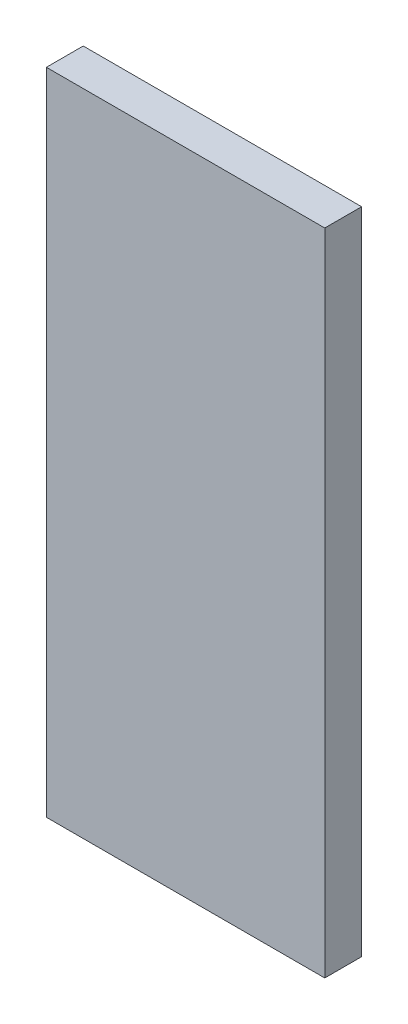
ISO-10303-21;
HEADER;
FILE_DESCRIPTION(('STEP AP214'),'2;1');
FILE_NAME('part.step','',(''),(''),'','','');
FILE_SCHEMA(('AUTOMOTIVE_DESIGN { 1 0 10303 214 1 1 1 1 }'));
ENDSEC;
DATA;
#1=APPLICATION_CONTEXT('core data for automotive mechanical design processes');
#2=APPLICATION_PROTOCOL_DEFINITION('international standard','automotive_design',2000,#1);
#3=PRODUCT_CONTEXT('',#1,'mechanical');
#4=PRODUCT('Part','Part','',(#3));
#5=PRODUCT_RELATED_PRODUCT_CATEGORY('part','',(#4));
#6=PRODUCT_DEFINITION_FORMATION('','',#4);
#7=PRODUCT_DEFINITION_CONTEXT('part definition',#1,'design');
#8=PRODUCT_DEFINITION('design','',#6,#7);
#9=PRODUCT_DEFINITION_SHAPE('','',#8);
#10=(LENGTH_UNIT() NAMED_UNIT(*) SI_UNIT(.MILLI.,.METRE.));
#11=(NAMED_UNIT(*) PLANE_ANGLE_UNIT() SI_UNIT($,.RADIAN.));
#12=(NAMED_UNIT(*) SI_UNIT($,.STERADIAN.) SOLID_ANGLE_UNIT());
#13=UNCERTAINTY_MEASURE_WITH_UNIT(LENGTH_MEASURE(1.E-05),#10,'distance_accuracy_value','');
#14=(GEOMETRIC_REPRESENTATION_CONTEXT(3) GLOBAL_UNCERTAINTY_ASSIGNED_CONTEXT((#13)) GLOBAL_UNIT_ASSIGNED_CONTEXT((#10,
#11,#12)) REPRESENTATION_CONTEXT('',''));
#15=CARTESIAN_POINT('',(0.,0.,0.));
#16=DIRECTION('',(0.,0.,1.));
#17=DIRECTION('',(1.,0.,0.));
#18=AXIS2_PLACEMENT_3D('',#15,#16,#17);
#19=CARTESIAN_POINT('',(7.55339205056771,-17.6248732918793,2.));
#20=DIRECTION('',(-1.,0.,0.));
#21=DIRECTION('',(0.,0.,1.));
#22=AXIS2_PLACEMENT_3D('',#19,#20,#21);
#23=PLANE('',#22);
#24=DIRECTION('',(0.,1.,0.));
#25=VECTOR('',#24,1.);
#26=CARTESIAN_POINT('',(7.55339205056771,-17.6248732918793,0.));
#27=LINE('',#26,#25);
#28=CARTESIAN_POINT('',(7.55339205056771,-17.6248732918793,0.));
#29=VERTEX_POINT('',#28);
#30=CARTESIAN_POINT('',(7.55339205056771,17.6248732918793,0.));
#31=VERTEX_POINT('',#30);
#32=EDGE_CURVE('E100',#29,#31,#27,.T.);
#33=ORIENTED_EDGE('',*,*,#32,.T.);
#34=DIRECTION('',(0.,0.,-1.));
#35=VECTOR('',#34,1.);
#36=CARTESIAN_POINT('',(7.55339205056771,17.6248732918793,2.));
#37=LINE('',#36,#35);
#38=CARTESIAN_POINT('',(7.55339205056771,17.6248732918793,2.));
#39=VERTEX_POINT('',#38);
#40=EDGE_CURVE('E91',#39,#31,#37,.T.);
#41=ORIENTED_EDGE('',*,*,#40,.F.);
#42=DIRECTION('',(0.,1.,0.));
#43=VECTOR('',#42,1.);
#44=CARTESIAN_POINT('',(7.55339205056771,-17.6248732918793,2.));
#45=LINE('',#44,#43);
#46=CARTESIAN_POINT('',(7.55339205056771,-17.6248732918793,2.));
#47=VERTEX_POINT('',#46);
#48=EDGE_CURVE('E85',#47,#39,#45,.T.);
#49=ORIENTED_EDGE('',*,*,#48,.F.);
#50=DIRECTION('',(0.,0.,-1.));
#51=VECTOR('',#50,1.);
#52=CARTESIAN_POINT('',(7.55339205056771,-17.6248732918793,2.));
#53=LINE('',#52,#51);
#54=EDGE_CURVE('E96',#47,#29,#53,.T.);
#55=ORIENTED_EDGE('',*,*,#54,.T.);
#56=EDGE_LOOP('',(#33,#41,#49,#55));
#57=FACE_BOUND('',#56,.T.);
#58=ADVANCED_FACE('F32',(#57),#23,.F.);
#59=CARTESIAN_POINT('',(-7.55339205056771,17.6248732918793,2.));
#60=DIRECTION('',(0.,-1.,0.));
#61=DIRECTION('',(0.,0.,-1.));
#62=AXIS2_PLACEMENT_3D('',#59,#60,#61);
#63=PLANE('',#62);
#64=DIRECTION('',(-1.,0.,0.));
#65=VECTOR('',#64,1.);
#66=CARTESIAN_POINT('',(-7.55339205056771,17.6248732918793,0.));
#67=LINE('',#66,#65);
#68=CARTESIAN_POINT('',(-7.55339205056771,17.6248732918793,0.));
#69=VERTEX_POINT('',#68);
#70=EDGE_CURVE('E90',#31,#69,#67,.T.);
#71=ORIENTED_EDGE('',*,*,#70,.T.);
#72=DIRECTION('',(0.,0.,-1.));
#73=VECTOR('',#72,1.);
#74=CARTESIAN_POINT('',(-7.55339205056771,17.6248732918793,2.));
#75=LINE('',#74,#73);
#76=CARTESIAN_POINT('',(-7.55339205056771,17.6248732918793,2.));
#77=VERTEX_POINT('',#76);
#78=EDGE_CURVE('E88',#77,#69,#75,.T.);
#79=ORIENTED_EDGE('',*,*,#78,.F.);
#80=DIRECTION('',(-1.,0.,0.));
#81=VECTOR('',#80,1.);
#82=CARTESIAN_POINT('',(-7.55339205056771,17.6248732918793,2.));
#83=LINE('',#82,#81);
#84=EDGE_CURVE('E80',#39,#77,#83,.T.);
#85=ORIENTED_EDGE('',*,*,#84,.F.);
#86=ORIENTED_EDGE('',*,*,#40,.T.);
#87=EDGE_LOOP('',(#71,#79,#85,#86));
#88=FACE_BOUND('',#87,.T.);
#89=ADVANCED_FACE('F89',(#88),#63,.F.);
#90=CARTESIAN_POINT('',(-7.55339205056771,-17.6248732918793,2.));
#91=DIRECTION('',(1.,0.,0.));
#92=DIRECTION('',(0.,0.,-1.));
#93=AXIS2_PLACEMENT_3D('',#90,#91,#92);
#94=PLANE('',#93);
#95=DIRECTION('',(0.,-1.,0.));
#96=VECTOR('',#95,1.);
#97=CARTESIAN_POINT('',(-7.55339205056771,-17.6248732918793,0.));
#98=LINE('',#97,#96);
#99=CARTESIAN_POINT('',(-7.55339205056771,-17.6248732918793,0.));
#100=VERTEX_POINT('',#99);
#101=EDGE_CURVE('E66',#69,#100,#98,.T.);
#102=ORIENTED_EDGE('',*,*,#101,.T.);
#103=DIRECTION('',(0.,0.,-1.));
#104=VECTOR('',#103,1.);
#105=CARTESIAN_POINT('',(-7.55339205056771,-17.6248732918793,2.));
#106=LINE('',#105,#104);
#107=CARTESIAN_POINT('',(-7.55339205056771,-17.6248732918793,2.));
#108=VERTEX_POINT('',#107);
#109=EDGE_CURVE('E92',#108,#100,#106,.T.);
#110=ORIENTED_EDGE('',*,*,#109,.F.);
#111=DIRECTION('',(0.,-1.,0.));
#112=VECTOR('',#111,1.);
#113=CARTESIAN_POINT('',(-7.55339205056771,-17.6248732918793,2.));
#114=LINE('',#113,#112);
#115=EDGE_CURVE('E83',#77,#108,#114,.T.);
#116=ORIENTED_EDGE('',*,*,#115,.F.);
#117=ORIENTED_EDGE('',*,*,#78,.T.);
#118=EDGE_LOOP('',(#102,#110,#116,#117));
#119=FACE_BOUND('',#118,.T.);
#120=ADVANCED_FACE('F94',(#119),#94,.F.);
#121=CARTESIAN_POINT('',(-7.55339205056771,-17.6248732918793,2.));
#122=DIRECTION('',(0.,1.,0.));
#123=DIRECTION('',(0.,0.,1.));
#124=AXIS2_PLACEMENT_3D('',#121,#122,#123);
#125=PLANE('',#124);
#126=DIRECTION('',(1.,0.,0.));
#127=VECTOR('',#126,1.);
#128=CARTESIAN_POINT('',(-7.55339205056771,-17.6248732918793,0.));
#129=LINE('',#128,#127);
#130=EDGE_CURVE('E72',#100,#29,#129,.T.);
#131=ORIENTED_EDGE('',*,*,#130,.T.);
#132=ORIENTED_EDGE('',*,*,#54,.F.);
#133=DIRECTION('',(1.,0.,0.));
#134=VECTOR('',#133,1.);
#135=CARTESIAN_POINT('',(-7.55339205056771,-17.6248732918793,2.));
#136=LINE('',#135,#134);
#137=EDGE_CURVE('E49',#108,#47,#136,.T.);
#138=ORIENTED_EDGE('',*,*,#137,.F.);
#139=ORIENTED_EDGE('',*,*,#109,.T.);
#140=EDGE_LOOP('',(#131,#132,#138,#139));
#141=FACE_BOUND('',#140,.T.);
#142=ADVANCED_FACE('F139',(#141),#125,.F.);
#143=CARTESIAN_POINT('',(0.,0.,2.));
#144=DIRECTION('',(0.,0.,-1.));
#145=DIRECTION('',(-1.,0.,0.));
#146=AXIS2_PLACEMENT_3D('',#143,#144,#145);
#147=PLANE('',#146);
#148=ORIENTED_EDGE('',*,*,#48,.T.);
#149=ORIENTED_EDGE('',*,*,#84,.T.);
#150=ORIENTED_EDGE('',*,*,#115,.T.);
#151=ORIENTED_EDGE('',*,*,#137,.T.);
#152=EDGE_LOOP('',(#148,#149,#150,#151));
#153=FACE_BOUND('',#152,.T.);
#154=ADVANCED_FACE('F81',(#153),#147,.F.);
#155=CARTESIAN_POINT('',(0.,0.,0.));
#156=DIRECTION('',(0.,0.,-1.));
#157=DIRECTION('',(-1.,0.,0.));
#158=AXIS2_PLACEMENT_3D('',#155,#156,#157);
#159=PLANE('',#158);
#160=CARTESIAN_POINT('',(0.,0.,0.));
#161=DIRECTION('',(0.,0.,-1.));
#162=DIRECTION('',(-1.,0.,0.));
#163=AXIS2_PLACEMENT_3D('',#160,#161,#162);
#164=CIRCLE('',#163,2.13517825626752);
#165=CARTESIAN_POINT('',(-2.13517825626752,0.,0.));
#166=VERTEX_POINT('',#165);
#167=EDGE_CURVE('E234',#166,#166,#164,.T.);
#168=ORIENTED_EDGE('',*,*,#167,.F.);
#169=EDGE_LOOP('',(#168));
#170=FACE_BOUND('',#169,.T.);
#171=CARTESIAN_POINT('',(0.,10.5415906277031,0.));
#172=DIRECTION('',(0.,0.,-1.));
#173=DIRECTION('',(-1.,0.,0.));
#174=AXIS2_PLACEMENT_3D('',#171,#172,#173);
#175=CIRCLE('',#174,1.88008087449413);
#176=CARTESIAN_POINT('',(-1.88008087449413,10.5415906277031,0.));
#177=VERTEX_POINT('',#176);
#178=EDGE_CURVE('E103',#177,#177,#175,.T.);
#179=ORIENTED_EDGE('',*,*,#178,.F.);
#180=EDGE_LOOP('',(#179));
#181=FACE_BOUND('',#180,.T.);
#182=ORIENTED_EDGE('',*,*,#32,.F.);
#183=ORIENTED_EDGE('',*,*,#130,.F.);
#184=ORIENTED_EDGE('',*,*,#101,.F.);
#185=ORIENTED_EDGE('',*,*,#70,.F.);
#186=EDGE_LOOP('',(#182,#183,#184,#185));
#187=FACE_BOUND('',#186,.T.);
#188=ADVANCED_FACE('F142',(#170,#181,#187),#159,.T.);
#189=CARTESIAN_POINT('',(0.,10.5415906277031,-3.));
#190=DIRECTION('',(0.,0.,1.));
#191=DIRECTION('',(1.,0.,0.));
#192=AXIS2_PLACEMENT_3D('',#189,#190,#191);
#193=CYLINDRICAL_SURFACE('',#192,1.88008087449413);
#194=CARTESIAN_POINT('',(0.,10.5415906277031,-1.5));
#195=DIRECTION('',(0.,0.,-1.));
#196=DIRECTION('',(-1.,0.,0.));
#197=AXIS2_PLACEMENT_3D('',#194,#195,#196);
#198=CIRCLE('',#197,1.88008087449413);
#199=CARTESIAN_POINT('',(-1.88008087449413,10.5415906277031,-1.5));
#200=VERTEX_POINT('',#199);
#201=EDGE_CURVE('E11',#200,#200,#198,.F.);
#202=ORIENTED_EDGE('',*,*,#201,.T.);
#203=EDGE_LOOP('',(#202));
#204=FACE_BOUND('',#203,.T.);
#205=ORIENTED_EDGE('',*,*,#178,.T.);
#206=EDGE_LOOP('',(#205));
#207=FACE_BOUND('',#206,.T.);
#208=ADVANCED_FACE('F145',(#204,#207),#193,.T.);
#209=CARTESIAN_POINT('',(0.,10.5415906277031,-3.));
#210=DIRECTION('',(0.,0.,-1.));
#211=DIRECTION('',(-1.,0.,0.));
#212=AXIS2_PLACEMENT_3D('',#209,#210,#211);
#213=PLANE('',#212);
#214=CARTESIAN_POINT('',(0.,10.5415906277031,-3.));
#215=DIRECTION('',(0.,0.,-1.));
#216=DIRECTION('',(-1.,0.,0.));
#217=AXIS2_PLACEMENT_3D('',#214,#215,#216);
#218=CIRCLE('',#217,0.380080874494128);
#219=CARTESIAN_POINT('',(-0.380080874494128,10.5415906277031,-3.));
#220=VERTEX_POINT('',#219);
#221=EDGE_CURVE('E41',#220,#220,#218,.T.);
#222=ORIENTED_EDGE('',*,*,#221,.T.);
#223=EDGE_LOOP('',(#222));
#224=FACE_BOUND('',#223,.T.);
#225=ADVANCED_FACE('F118',(#224),#213,.T.);
#226=CARTESIAN_POINT('',(0.,0.,-3.));
#227=DIRECTION('',(0.,0.,1.));
#228=DIRECTION('',(1.,0.,0.));
#229=AXIS2_PLACEMENT_3D('',#226,#227,#228);
#230=CYLINDRICAL_SURFACE('',#229,2.13517825626752);
#231=CARTESIAN_POINT('',(0.,0.,-1.5));
#232=DIRECTION('',(0.,0.,-1.));
#233=DIRECTION('',(-1.,0.,0.));
#234=AXIS2_PLACEMENT_3D('',#231,#232,#233);
#235=CIRCLE('',#234,2.13517825626752);
#236=CARTESIAN_POINT('',(-2.13517825626752,0.,-1.5));
#237=VERTEX_POINT('',#236);
#238=EDGE_CURVE('E113',#237,#237,#235,.F.);
#239=ORIENTED_EDGE('',*,*,#238,.T.);
#240=EDGE_LOOP('',(#239));
#241=FACE_BOUND('',#240,.T.);
#242=ORIENTED_EDGE('',*,*,#167,.T.);
#243=EDGE_LOOP('',(#242));
#244=FACE_BOUND('',#243,.T.);
#245=ADVANCED_FACE('F154',(#241,#244),#230,.T.);
#246=CARTESIAN_POINT('',(0.,0.,-3.));
#247=DIRECTION('',(0.,0.,-1.));
#248=DIRECTION('',(-1.,0.,0.));
#249=AXIS2_PLACEMENT_3D('',#246,#247,#248);
#250=PLANE('',#249);
#251=CARTESIAN_POINT('',(0.,0.,-3.));
#252=DIRECTION('',(0.,0.,-1.));
#253=DIRECTION('',(-1.,0.,0.));
#254=AXIS2_PLACEMENT_3D('',#251,#252,#253);
#255=CIRCLE('',#254,0.635178256267523);
#256=CARTESIAN_POINT('',(-0.635178256267523,0.,-3.));
#257=VERTEX_POINT('',#256);
#258=EDGE_CURVE('E110',#257,#257,#255,.T.);
#259=ORIENTED_EDGE('',*,*,#258,.T.);
#260=EDGE_LOOP('',(#259));
#261=FACE_BOUND('',#260,.T.);
#262=ADVANCED_FACE('F126',(#261),#250,.T.);
#263=CARTESIAN_POINT('',(0.,0.,-1.5));
#264=DIRECTION('',(0.,0.,-1.));
#265=DIRECTION('',(-1.,0.,0.));
#266=AXIS2_PLACEMENT_3D('',#263,#264,#265);
#267=DEGENERATE_TOROIDAL_SURFACE('',#266,0.635178256267523,1.5,.T.);
#268=ORIENTED_EDGE('',*,*,#238,.F.);
#269=EDGE_LOOP('',(#268));
#270=FACE_BOUND('',#269,.T.);
#271=ORIENTED_EDGE('',*,*,#258,.F.);
#272=EDGE_LOOP('',(#271));
#273=FACE_BOUND('',#272,.T.);
#274=ADVANCED_FACE('F121',(#270,#273),#267,.T.);
#275=CARTESIAN_POINT('',(0.,10.5415906277031,-1.5));
#276=DIRECTION('',(0.,0.,-1.));
#277=DIRECTION('',(-1.,0.,0.));
#278=AXIS2_PLACEMENT_3D('',#275,#276,#277);
#279=DEGENERATE_TOROIDAL_SURFACE('',#278,0.380080874494128,1.5,.T.);
#280=ORIENTED_EDGE('',*,*,#201,.F.);
#281=EDGE_LOOP('',(#280));
#282=FACE_BOUND('',#281,.T.);
#283=ORIENTED_EDGE('',*,*,#221,.F.);
#284=EDGE_LOOP('',(#283));
#285=FACE_BOUND('',#284,.T.);
#286=ADVANCED_FACE('F34',(#282,#285),#279,.T.);
#287=CLOSED_SHELL('',(#58,#89,#120,#142,#154,#188,#208,#225,#245,#262,#274,#286));
#288=MANIFOLD_SOLID_BREP('B2',#287);
#289=ADVANCED_BREP_SHAPE_REPRESENTATION('',(#18,#288),#14);
#290=SHAPE_DEFINITION_REPRESENTATION(#9,#289);
ENDSEC;
END-ISO-10303-21;
